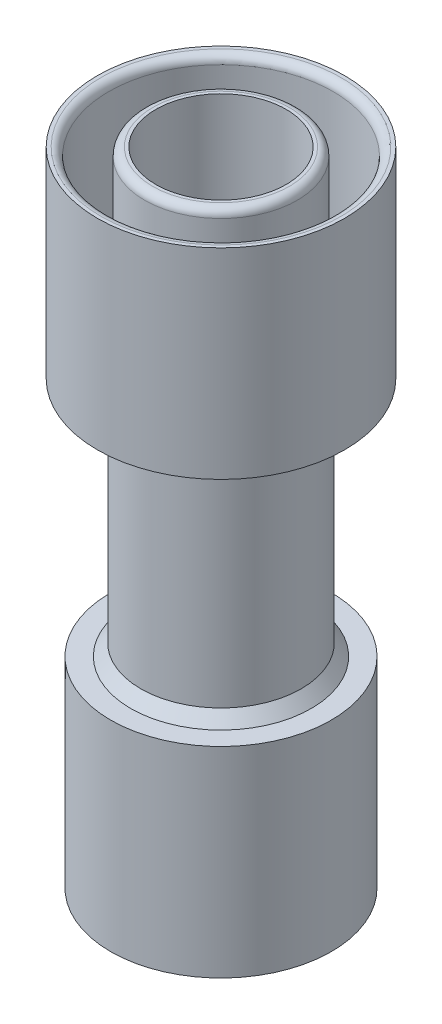
ISO-10303-21;
HEADER;
FILE_DESCRIPTION(('STEP AP214'),'2;1');
FILE_NAME('part.step','',(''),(''),'','','');
FILE_SCHEMA(('AUTOMOTIVE_DESIGN { 1 0 10303 214 1 1 1 1 }'));
ENDSEC;
DATA;
#1=APPLICATION_CONTEXT('core data for automotive mechanical design processes');
#2=APPLICATION_PROTOCOL_DEFINITION('international standard','automotive_design',2000,#1);
#3=PRODUCT_CONTEXT('',#1,'mechanical');
#4=PRODUCT('Part','Part','',(#3));
#5=PRODUCT_RELATED_PRODUCT_CATEGORY('part','',(#4));
#6=PRODUCT_DEFINITION_FORMATION('','',#4);
#7=PRODUCT_DEFINITION_CONTEXT('part definition',#1,'design');
#8=PRODUCT_DEFINITION('design','',#6,#7);
#9=PRODUCT_DEFINITION_SHAPE('','',#8);
#10=(LENGTH_UNIT() NAMED_UNIT(*) SI_UNIT(.MILLI.,.METRE.));
#11=(NAMED_UNIT(*) PLANE_ANGLE_UNIT() SI_UNIT($,.RADIAN.));
#12=(NAMED_UNIT(*) SI_UNIT($,.STERADIAN.) SOLID_ANGLE_UNIT());
#13=UNCERTAINTY_MEASURE_WITH_UNIT(LENGTH_MEASURE(1.E-05),#10,'distance_accuracy_value','');
#14=(GEOMETRIC_REPRESENTATION_CONTEXT(3) GLOBAL_UNCERTAINTY_ASSIGNED_CONTEXT((#13)) GLOBAL_UNIT_ASSIGNED_CONTEXT((#10,
#11,#12)) REPRESENTATION_CONTEXT('',''));
#15=CARTESIAN_POINT('',(0.,0.,0.));
#16=DIRECTION('',(0.,0.,1.));
#17=DIRECTION('',(1.,0.,0.));
#18=AXIS2_PLACEMENT_3D('',#15,#16,#17);
#19=CARTESIAN_POINT('',(0.,64.,0.));
#20=DIRECTION('',(0.,1.,0.));
#21=DIRECTION('',(0.,0.,1.));
#22=AXIS2_PLACEMENT_3D('',#19,#20,#21);
#23=PLANE('',#22);
#24=CARTESIAN_POINT('',(0.,64.,0.));
#25=DIRECTION('',(0.,1.,0.));
#26=DIRECTION('',(0.,0.,1.));
#27=AXIS2_PLACEMENT_3D('',#24,#25,#26);
#28=CIRCLE('',#27,6.815);
#29=CARTESIAN_POINT('',(0.,64.,6.815));
#30=VERTEX_POINT('',#29);
#31=EDGE_CURVE('E51',#30,#30,#28,.T.);
#32=ORIENTED_EDGE('',*,*,#31,.T.);
#33=EDGE_LOOP('',(#32));
#34=FACE_BOUND('',#33,.T.);
#35=CARTESIAN_POINT('',(0.,64.,0.));
#36=DIRECTION('',(0.,1.,0.));
#37=DIRECTION('',(0.,0.,1.));
#38=AXIS2_PLACEMENT_3D('',#35,#36,#37);
#39=CIRCLE('',#38,6.5);
#40=CARTESIAN_POINT('',(0.,64.,6.5));
#41=VERTEX_POINT('',#40);
#42=EDGE_CURVE('E82',#41,#41,#39,.T.);
#43=ORIENTED_EDGE('',*,*,#42,.F.);
#44=EDGE_LOOP('',(#43));
#45=FACE_BOUND('',#44,.T.);
#46=ADVANCED_FACE('F43',(#34,#45),#23,.T.);
#47=CARTESIAN_POINT('',(0.,42.,0.));
#48=DIRECTION('',(0.,1.,0.));
#49=DIRECTION('',(0.,0.,1.));
#50=AXIS2_PLACEMENT_3D('',#47,#48,#49);
#51=TOROIDAL_SURFACE('',#50,10.,2.);
#52=CARTESIAN_POINT('',(0.,42.,0.));
#53=DIRECTION('',(0.,1.,0.));
#54=DIRECTION('',(0.,0.,1.));
#55=AXIS2_PLACEMENT_3D('',#52,#53,#54);
#56=CIRCLE('',#55,8.);
#57=CARTESIAN_POINT('',(0.,42.,8.));
#58=VERTEX_POINT('',#57);
#59=EDGE_CURVE('E128',#58,#58,#56,.T.);
#60=ORIENTED_EDGE('',*,*,#59,.T.);
#61=EDGE_LOOP('',(#60));
#62=FACE_BOUND('',#61,.T.);
#63=CARTESIAN_POINT('',(0.,44.,0.));
#64=DIRECTION('',(0.,1.,0.));
#65=DIRECTION('',(0.,0.,1.));
#66=AXIS2_PLACEMENT_3D('',#63,#64,#65);
#67=CIRCLE('',#66,10.);
#68=CARTESIAN_POINT('',(0.,44.,10.));
#69=VERTEX_POINT('',#68);
#70=EDGE_CURVE('E70',#69,#69,#67,.T.);
#71=ORIENTED_EDGE('',*,*,#70,.F.);
#72=EDGE_LOOP('',(#71));
#73=FACE_BOUND('',#72,.T.);
#74=ADVANCED_FACE('F160',(#62,#73),#51,.F.);
#75=CARTESIAN_POINT('',(0.,44.,0.));
#76=DIRECTION('',(0.,-1.,0.));
#77=DIRECTION('',(0.,0.,-1.));
#78=AXIS2_PLACEMENT_3D('',#75,#76,#77);
#79=PLANE('',#78);
#80=ORIENTED_EDGE('',*,*,#70,.T.);
#81=EDGE_LOOP('',(#80));
#82=FACE_BOUND('',#81,.T.);
#83=CARTESIAN_POINT('',(0.,44.,0.));
#84=DIRECTION('',(0.,1.,0.));
#85=DIRECTION('',(0.,0.,1.));
#86=AXIS2_PLACEMENT_3D('',#83,#84,#85);
#87=CIRCLE('',#86,12.33);
#88=CARTESIAN_POINT('',(0.,44.,12.33));
#89=VERTEX_POINT('',#88);
#90=EDGE_CURVE('E74',#89,#89,#87,.T.);
#91=ORIENTED_EDGE('',*,*,#90,.F.);
#92=EDGE_LOOP('',(#91));
#93=FACE_BOUND('',#92,.T.);
#94=ADVANCED_FACE('F166',(#82,#93),#79,.T.);
#95=CARTESIAN_POINT('',(0.,34.0501237623762,0.));
#96=DIRECTION('',(0.,1.,0.));
#97=DIRECTION('',(0.,0.,1.));
#98=AXIS2_PLACEMENT_3D('',#95,#96,#97);
#99=CYLINDRICAL_SURFACE('',#98,12.33);
#100=ORIENTED_EDGE('',*,*,#90,.T.);
#101=EDGE_LOOP('',(#100));
#102=FACE_BOUND('',#101,.T.);
#103=CARTESIAN_POINT('',(0.,64.,0.));
#104=DIRECTION('',(0.,1.,0.));
#105=DIRECTION('',(0.,0.,1.));
#106=AXIS2_PLACEMENT_3D('',#103,#104,#105);
#107=CIRCLE('',#106,12.33);
#108=CARTESIAN_POINT('',(0.,64.,12.33));
#109=VERTEX_POINT('',#108);
#110=EDGE_CURVE('E78',#109,#109,#107,.T.);
#111=ORIENTED_EDGE('',*,*,#110,.F.);
#112=EDGE_LOOP('',(#111));
#113=FACE_BOUND('',#112,.T.);
#114=ADVANCED_FACE('F174',(#102,#113),#99,.T.);
#115=CARTESIAN_POINT('',(0.,64.,0.));
#116=DIRECTION('',(0.,1.,0.));
#117=DIRECTION('',(0.,0.,1.));
#118=AXIS2_PLACEMENT_3D('',#115,#116,#117);
#119=CIRCLE('',#118,11.98);
#120=CARTESIAN_POINT('',(0.,64.,11.98));
#121=VERTEX_POINT('',#120);
#122=EDGE_CURVE('E58',#121,#121,#119,.F.);
#123=ORIENTED_EDGE('',*,*,#122,.T.);
#124=EDGE_LOOP('',(#123));
#125=FACE_BOUND('',#124,.T.);
#126=ORIENTED_EDGE('',*,*,#110,.T.);
#127=EDGE_LOOP('',(#126));
#128=FACE_BOUND('',#127,.T.);
#129=ADVANCED_FACE('F162',(#125,#128),#23,.T.);
#130=CARTESIAN_POINT('',(0.,34.0501237623762,0.));
#131=DIRECTION('',(0.,1.,0.));
#132=DIRECTION('',(0.,0.,1.));
#133=AXIS2_PLACEMENT_3D('',#130,#131,#132);
#134=CYLINDRICAL_SURFACE('',#133,6.5);
#135=ORIENTED_EDGE('',*,*,#42,.T.);
#136=EDGE_LOOP('',(#135));
#137=FACE_BOUND('',#136,.T.);
#138=CARTESIAN_POINT('',(0.,45.4658569188909,0.));
#139=DIRECTION('',(0.,1.,0.));
#140=DIRECTION('',(0.,0.,1.));
#141=AXIS2_PLACEMENT_3D('',#138,#139,#140);
#142=CIRCLE('',#141,6.5);
#143=CARTESIAN_POINT('',(0.,45.4658569188909,6.5));
#144=VERTEX_POINT('',#143);
#145=EDGE_CURVE('E86',#144,#144,#142,.T.);
#146=ORIENTED_EDGE('',*,*,#145,.F.);
#147=EDGE_LOOP('',(#146));
#148=FACE_BOUND('',#147,.T.);
#149=ADVANCED_FACE('F173',(#137,#148),#134,.F.);
#150=CARTESIAN_POINT('',(0.,37.4658569188909,0.));
#151=DIRECTION('',(0.,1.,0.));
#152=DIRECTION('',(0.,0.,1.));
#153=AXIS2_PLACEMENT_3D('',#150,#151,#152);
#154=CONICAL_SURFACE('',#153,4.5,0.244978663126864);
#155=ORIENTED_EDGE('',*,*,#145,.T.);
#156=EDGE_LOOP('',(#155));
#157=FACE_BOUND('',#156,.T.);
#158=CARTESIAN_POINT('',(0.,37.4658569188909,0.));
#159=DIRECTION('',(0.,1.,0.));
#160=DIRECTION('',(0.,0.,1.));
#161=AXIS2_PLACEMENT_3D('',#158,#159,#160);
#162=CIRCLE('',#161,4.5);
#163=CARTESIAN_POINT('',(0.,37.4658569188909,4.5));
#164=VERTEX_POINT('',#163);
#165=EDGE_CURVE('E89',#164,#164,#162,.T.);
#166=ORIENTED_EDGE('',*,*,#165,.F.);
#167=EDGE_LOOP('',(#166));
#168=FACE_BOUND('',#167,.T.);
#169=ADVANCED_FACE('F180',(#157,#168),#154,.F.);
#170=CARTESIAN_POINT('',(0.,34.0501237623762,0.));
#171=DIRECTION('',(0.,1.,0.));
#172=DIRECTION('',(0.,0.,1.));
#173=AXIS2_PLACEMENT_3D('',#170,#171,#172);
#174=CYLINDRICAL_SURFACE('',#173,4.5);
#175=ORIENTED_EDGE('',*,*,#165,.T.);
#176=EDGE_LOOP('',(#175));
#177=FACE_BOUND('',#176,.T.);
#178=CARTESIAN_POINT('',(0.,29.4658569188909,0.));
#179=DIRECTION('',(0.,1.,0.));
#180=DIRECTION('',(0.,0.,1.));
#181=AXIS2_PLACEMENT_3D('',#178,#179,#180);
#182=CIRCLE('',#181,4.5);
#183=CARTESIAN_POINT('',(0.,29.4658569188909,4.5));
#184=VERTEX_POINT('',#183);
#185=EDGE_CURVE('E93',#184,#184,#182,.T.);
#186=ORIENTED_EDGE('',*,*,#185,.F.);
#187=EDGE_LOOP('',(#186));
#188=FACE_BOUND('',#187,.T.);
#189=ADVANCED_FACE('F231',(#177,#188),#174,.F.);
#190=CARTESIAN_POINT('',(0.,25.4658569188909,0.));
#191=DIRECTION('',(0.,-1.,0.));
#192=DIRECTION('',(0.,0.,-1.));
#193=AXIS2_PLACEMENT_3D('',#190,#191,#192);
#194=CONICAL_SURFACE('',#193,6.5,0.463647609000806);
#195=ORIENTED_EDGE('',*,*,#185,.T.);
#196=EDGE_LOOP('',(#195));
#197=FACE_BOUND('',#196,.T.);
#198=CARTESIAN_POINT('',(0.,25.4658569188909,0.));
#199=DIRECTION('',(0.,1.,0.));
#200=DIRECTION('',(0.,0.,1.));
#201=AXIS2_PLACEMENT_3D('',#198,#199,#200);
#202=CIRCLE('',#201,6.5);
#203=CARTESIAN_POINT('',(0.,25.4658569188909,6.5));
#204=VERTEX_POINT('',#203);
#205=EDGE_CURVE('E97',#204,#204,#202,.T.);
#206=ORIENTED_EDGE('',*,*,#205,.F.);
#207=EDGE_LOOP('',(#206));
#208=FACE_BOUND('',#207,.T.);
#209=ADVANCED_FACE('F241',(#197,#208),#194,.F.);
#210=CARTESIAN_POINT('',(0.,34.0501237623762,0.));
#211=DIRECTION('',(0.,1.,0.));
#212=DIRECTION('',(0.,0.,1.));
#213=AXIS2_PLACEMENT_3D('',#210,#211,#212);
#214=CYLINDRICAL_SURFACE('',#213,6.5);
#215=ORIENTED_EDGE('',*,*,#205,.T.);
#216=EDGE_LOOP('',(#215));
#217=FACE_BOUND('',#216,.T.);
#218=CARTESIAN_POINT('',(0.,17.4658569188909,0.));
#219=DIRECTION('',(0.,1.,0.));
#220=DIRECTION('',(0.,0.,1.));
#221=AXIS2_PLACEMENT_3D('',#218,#219,#220);
#222=CIRCLE('',#221,6.5);
#223=CARTESIAN_POINT('',(0.,17.4658569188909,6.5));
#224=VERTEX_POINT('',#223);
#225=EDGE_CURVE('E101',#224,#224,#222,.T.);
#226=ORIENTED_EDGE('',*,*,#225,.F.);
#227=EDGE_LOOP('',(#226));
#228=FACE_BOUND('',#227,.T.);
#229=ADVANCED_FACE('F249',(#217,#228),#214,.F.);
#230=CARTESIAN_POINT('',(0.,16.,0.));
#231=DIRECTION('',(0.,-1.,0.));
#232=DIRECTION('',(0.,0.,-1.));
#233=AXIS2_PLACEMENT_3D('',#230,#231,#232);
#234=CONICAL_SURFACE('',#233,7.73,0.698131700797732);
#235=ORIENTED_EDGE('',*,*,#225,.T.);
#236=EDGE_LOOP('',(#235));
#237=FACE_BOUND('',#236,.T.);
#238=CARTESIAN_POINT('',(0.,16.,0.));
#239=DIRECTION('',(0.,1.,0.));
#240=DIRECTION('',(0.,0.,1.));
#241=AXIS2_PLACEMENT_3D('',#238,#239,#240);
#242=CIRCLE('',#241,7.73);
#243=CARTESIAN_POINT('',(0.,16.,7.73));
#244=VERTEX_POINT('',#243);
#245=EDGE_CURVE('E105',#244,#244,#242,.T.);
#246=ORIENTED_EDGE('',*,*,#245,.F.);
#247=EDGE_LOOP('',(#246));
#248=FACE_BOUND('',#247,.T.);
#249=ADVANCED_FACE('F258',(#237,#248),#234,.F.);
#250=CARTESIAN_POINT('',(0.,34.0501237623762,0.));
#251=DIRECTION('',(0.,1.,0.));
#252=DIRECTION('',(0.,0.,1.));
#253=AXIS2_PLACEMENT_3D('',#250,#251,#252);
#254=CYLINDRICAL_SURFACE('',#253,7.73);
#255=ORIENTED_EDGE('',*,*,#245,.T.);
#256=EDGE_LOOP('',(#255));
#257=FACE_BOUND('',#256,.T.);
#258=CARTESIAN_POINT('',(0.,0.,0.));
#259=DIRECTION('',(0.,1.,0.));
#260=DIRECTION('',(0.,0.,1.));
#261=AXIS2_PLACEMENT_3D('',#258,#259,#260);
#262=CIRCLE('',#261,7.73);
#263=CARTESIAN_POINT('',(0.,0.,7.73));
#264=VERTEX_POINT('',#263);
#265=EDGE_CURVE('E108',#264,#264,#262,.T.);
#266=ORIENTED_EDGE('',*,*,#265,.F.);
#267=EDGE_LOOP('',(#266));
#268=FACE_BOUND('',#267,.T.);
#269=ADVANCED_FACE('F267',(#257,#268),#254,.F.);
#270=CARTESIAN_POINT('',(0.,0.,0.));
#271=DIRECTION('',(0.,-1.,0.));
#272=DIRECTION('',(0.,0.,-1.));
#273=AXIS2_PLACEMENT_3D('',#270,#271,#272);
#274=PLANE('',#273);
#275=ORIENTED_EDGE('',*,*,#265,.T.);
#276=EDGE_LOOP('',(#275));
#277=FACE_BOUND('',#276,.T.);
#278=CARTESIAN_POINT('',(0.,0.,0.));
#279=DIRECTION('',(0.,1.,0.));
#280=DIRECTION('',(0.,0.,1.));
#281=AXIS2_PLACEMENT_3D('',#278,#279,#280);
#282=CIRCLE('',#281,11.005);
#283=CARTESIAN_POINT('',(0.,0.,11.005));
#284=VERTEX_POINT('',#283);
#285=EDGE_CURVE('E112',#284,#284,#282,.T.);
#286=ORIENTED_EDGE('',*,*,#285,.F.);
#287=EDGE_LOOP('',(#286));
#288=FACE_BOUND('',#287,.T.);
#289=ADVANCED_FACE('F276',(#277,#288),#274,.T.);
#290=CARTESIAN_POINT('',(0.,34.0501237623762,0.));
#291=DIRECTION('',(0.,1.,0.));
#292=DIRECTION('',(0.,0.,1.));
#293=AXIS2_PLACEMENT_3D('',#290,#291,#292);
#294=CYLINDRICAL_SURFACE('',#293,11.005);
#295=ORIENTED_EDGE('',*,*,#285,.T.);
#296=EDGE_LOOP('',(#295));
#297=FACE_BOUND('',#296,.T.);
#298=CARTESIAN_POINT('',(0.,20.,0.));
#299=DIRECTION('',(0.,1.,0.));
#300=DIRECTION('',(0.,0.,1.));
#301=AXIS2_PLACEMENT_3D('',#298,#299,#300);
#302=CIRCLE('',#301,11.005);
#303=CARTESIAN_POINT('',(0.,20.,11.005));
#304=VERTEX_POINT('',#303);
#305=EDGE_CURVE('E116',#304,#304,#302,.T.);
#306=ORIENTED_EDGE('',*,*,#305,.F.);
#307=EDGE_LOOP('',(#306));
#308=FACE_BOUND('',#307,.T.);
#309=ADVANCED_FACE('F284',(#297,#308),#294,.T.);
#310=CARTESIAN_POINT('',(0.,20.,0.));
#311=DIRECTION('',(0.,1.,0.));
#312=DIRECTION('',(0.,0.,1.));
#313=AXIS2_PLACEMENT_3D('',#310,#311,#312);
#314=PLANE('',#313);
#315=ORIENTED_EDGE('',*,*,#305,.T.);
#316=EDGE_LOOP('',(#315));
#317=FACE_BOUND('',#316,.T.);
#318=CARTESIAN_POINT('',(0.,20.,0.));
#319=DIRECTION('',(0.,1.,0.));
#320=DIRECTION('',(0.,0.,1.));
#321=AXIS2_PLACEMENT_3D('',#318,#319,#320);
#322=CIRCLE('',#321,9.005);
#323=CARTESIAN_POINT('',(0.,20.,9.005));
#324=VERTEX_POINT('',#323);
#325=EDGE_CURVE('E120',#324,#324,#322,.T.);
#326=ORIENTED_EDGE('',*,*,#325,.F.);
#327=EDGE_LOOP('',(#326));
#328=FACE_BOUND('',#327,.T.);
#329=ADVANCED_FACE('F293',(#317,#328),#314,.T.);
#330=CARTESIAN_POINT('',(0.,21.1977123605572,0.));
#331=DIRECTION('',(0.,-1.,0.));
#332=DIRECTION('',(0.,0.,-1.));
#333=AXIS2_PLACEMENT_3D('',#330,#331,#332);
#334=CONICAL_SURFACE('',#333,8.,0.698131700797731);
#335=ORIENTED_EDGE('',*,*,#325,.T.);
#336=EDGE_LOOP('',(#335));
#337=FACE_BOUND('',#336,.T.);
#338=CARTESIAN_POINT('',(0.,21.1977123605572,0.));
#339=DIRECTION('',(0.,1.,0.));
#340=DIRECTION('',(0.,0.,1.));
#341=AXIS2_PLACEMENT_3D('',#338,#339,#340);
#342=CIRCLE('',#341,8.);
#343=CARTESIAN_POINT('',(0.,21.1977123605572,8.));
#344=VERTEX_POINT('',#343);
#345=EDGE_CURVE('E124',#344,#344,#342,.T.);
#346=ORIENTED_EDGE('',*,*,#345,.F.);
#347=EDGE_LOOP('',(#346));
#348=FACE_BOUND('',#347,.T.);
#349=ADVANCED_FACE('F156',(#337,#348),#334,.T.);
#350=CARTESIAN_POINT('',(0.,34.0501237623762,0.));
#351=DIRECTION('',(0.,1.,0.));
#352=DIRECTION('',(0.,0.,1.));
#353=AXIS2_PLACEMENT_3D('',#350,#351,#352);
#354=CYLINDRICAL_SURFACE('',#353,8.);
#355=ORIENTED_EDGE('',*,*,#345,.T.);
#356=EDGE_LOOP('',(#355));
#357=FACE_BOUND('',#356,.T.);
#358=ORIENTED_EDGE('',*,*,#59,.F.);
#359=EDGE_LOOP('',(#358));
#360=FACE_BOUND('',#359,.T.);
#361=ADVANCED_FACE('F150',(#357,#360),#354,.T.);
#362=CARTESIAN_POINT('',(0.,46.,0.));
#363=DIRECTION('',(0.,1.,0.));
#364=DIRECTION('',(0.,0.,1.));
#365=AXIS2_PLACEMENT_3D('',#362,#363,#364);
#366=CYLINDRICAL_SURFACE('',#365,11.18);
#367=CARTESIAN_POINT('',(0.,63.2,0.));
#368=DIRECTION('',(0.,1.,0.));
#369=DIRECTION('',(0.,0.,1.));
#370=AXIS2_PLACEMENT_3D('',#367,#368,#369);
#371=CIRCLE('',#370,11.18);
#372=CARTESIAN_POINT('',(0.,63.2,11.18));
#373=VERTEX_POINT('',#372);
#374=EDGE_CURVE('E64',#373,#373,#371,.T.);
#375=ORIENTED_EDGE('',*,*,#374,.T.);
#376=EDGE_LOOP('',(#375));
#377=FACE_BOUND('',#376,.T.);
#378=CARTESIAN_POINT('',(0.,46.,0.));
#379=DIRECTION('',(0.,1.,0.));
#380=DIRECTION('',(0.,0.,1.));
#381=AXIS2_PLACEMENT_3D('',#378,#379,#380);
#382=CIRCLE('',#381,11.18);
#383=CARTESIAN_POINT('',(0.,46.,11.18));
#384=VERTEX_POINT('',#383);
#385=EDGE_CURVE('E132',#384,#384,#382,.T.);
#386=ORIENTED_EDGE('',*,*,#385,.F.);
#387=EDGE_LOOP('',(#386));
#388=FACE_BOUND('',#387,.T.);
#389=ADVANCED_FACE('F145',(#377,#388),#366,.F.);
#390=CARTESIAN_POINT('',(0.,46.,0.));
#391=DIRECTION('',(0.,1.,0.));
#392=DIRECTION('',(0.,0.,1.));
#393=AXIS2_PLACEMENT_3D('',#390,#391,#392);
#394=PLANE('',#393);
#395=CARTESIAN_POINT('',(0.,46.,0.));
#396=DIRECTION('',(0.,1.,0.));
#397=DIRECTION('',(0.,0.,1.));
#398=AXIS2_PLACEMENT_3D('',#395,#396,#397);
#399=CIRCLE('',#398,7.615);
#400=CARTESIAN_POINT('',(0.,46.,7.615));
#401=VERTEX_POINT('',#400);
#402=EDGE_CURVE('E135',#401,#401,#399,.T.);
#403=ORIENTED_EDGE('',*,*,#402,.F.);
#404=EDGE_LOOP('',(#403));
#405=FACE_BOUND('',#404,.T.);
#406=ORIENTED_EDGE('',*,*,#385,.T.);
#407=EDGE_LOOP('',(#406));
#408=FACE_BOUND('',#407,.T.);
#409=ADVANCED_FACE('F142',(#405,#408),#394,.T.);
#410=CARTESIAN_POINT('',(0.,46.,0.));
#411=DIRECTION('',(0.,1.,0.));
#412=DIRECTION('',(0.,0.,1.));
#413=AXIS2_PLACEMENT_3D('',#410,#411,#412);
#414=CYLINDRICAL_SURFACE('',#413,7.615);
#415=CARTESIAN_POINT('',(0.,63.2,0.));
#416=DIRECTION('',(0.,1.,0.));
#417=DIRECTION('',(0.,0.,1.));
#418=AXIS2_PLACEMENT_3D('',#415,#416,#417);
#419=CIRCLE('',#418,7.615);
#420=CARTESIAN_POINT('',(0.,63.2,7.615));
#421=VERTEX_POINT('',#420);
#422=EDGE_CURVE('E10',#421,#421,#419,.F.);
#423=ORIENTED_EDGE('',*,*,#422,.T.);
#424=EDGE_LOOP('',(#423));
#425=FACE_BOUND('',#424,.T.);
#426=ORIENTED_EDGE('',*,*,#402,.T.);
#427=EDGE_LOOP('',(#426));
#428=FACE_BOUND('',#427,.T.);
#429=ADVANCED_FACE('F140',(#425,#428),#414,.T.);
#430=CARTESIAN_POINT('',(0.,63.2,0.));
#431=DIRECTION('',(0.,1.,0.));
#432=DIRECTION('',(0.,0.,1.));
#433=AXIS2_PLACEMENT_3D('',#430,#431,#432);
#434=TOROIDAL_SURFACE('',#433,11.98,0.8);
#435=ORIENTED_EDGE('',*,*,#122,.F.);
#436=EDGE_LOOP('',(#435));
#437=FACE_BOUND('',#436,.T.);
#438=ORIENTED_EDGE('',*,*,#374,.F.);
#439=EDGE_LOOP('',(#438));
#440=FACE_BOUND('',#439,.T.);
#441=ADVANCED_FACE('F188',(#437,#440),#434,.T.);
#442=CARTESIAN_POINT('',(0.,63.2,0.));
#443=DIRECTION('',(0.,1.,0.));
#444=DIRECTION('',(0.,0.,1.));
#445=AXIS2_PLACEMENT_3D('',#442,#443,#444);
#446=TOROIDAL_SURFACE('',#445,6.815,0.8);
#447=ORIENTED_EDGE('',*,*,#422,.F.);
#448=EDGE_LOOP('',(#447));
#449=FACE_BOUND('',#448,.T.);
#450=ORIENTED_EDGE('',*,*,#31,.F.);
#451=EDGE_LOOP('',(#450));
#452=FACE_BOUND('',#451,.T.);
#453=ADVANCED_FACE('F45',(#449,#452),#446,.T.);
#454=CLOSED_SHELL('',(#46,#74,#94,#114,#129,#149,#169,#189,#209,#229,#249,#269,#289,#309,#329,
#349,#361,#389,#409,#429,#441,#453));
#455=MANIFOLD_SOLID_BREP('B2',#454);
#456=ADVANCED_BREP_SHAPE_REPRESENTATION('',(#18,#455),#14);
#457=SHAPE_DEFINITION_REPRESENTATION(#9,#456);
ENDSEC;
END-ISO-10303-21;
